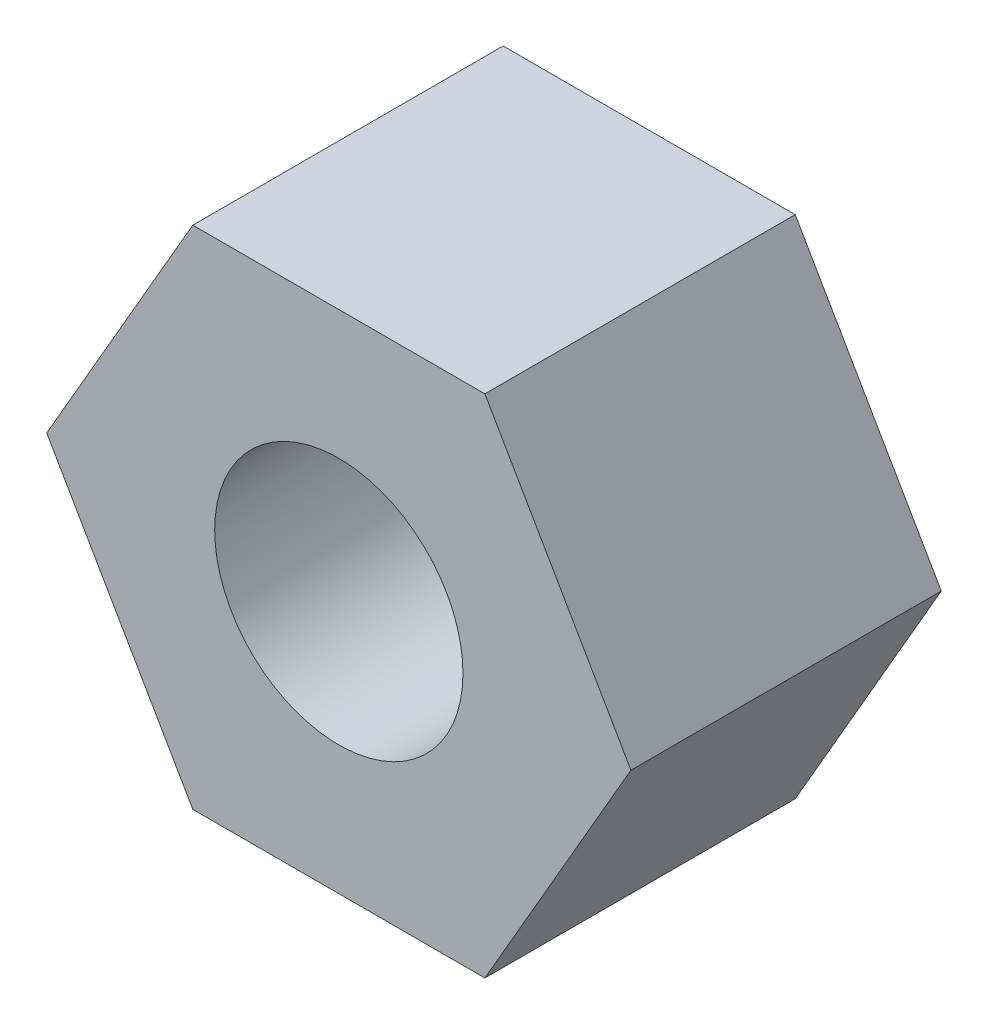
ISO-10303-21;
HEADER;
FILE_DESCRIPTION(('STEP AP214'),'2;1');
FILE_NAME('part.step','',(''),(''),'','','');
FILE_SCHEMA(('AUTOMOTIVE_DESIGN { 1 0 10303 214 1 1 1 1 }'));
ENDSEC;
DATA;
#1=APPLICATION_CONTEXT('core data for automotive mechanical design processes');
#2=APPLICATION_PROTOCOL_DEFINITION('international standard','automotive_design',2000,#1);
#3=PRODUCT_CONTEXT('',#1,'mechanical');
#4=PRODUCT('Part','Part','',(#3));
#5=PRODUCT_RELATED_PRODUCT_CATEGORY('part','',(#4));
#6=PRODUCT_DEFINITION_FORMATION('','',#4);
#7=PRODUCT_DEFINITION_CONTEXT('part definition',#1,'design');
#8=PRODUCT_DEFINITION('design','',#6,#7);
#9=PRODUCT_DEFINITION_SHAPE('','',#8);
#10=(LENGTH_UNIT() NAMED_UNIT(*) SI_UNIT(.MILLI.,.METRE.));
#11=(NAMED_UNIT(*) PLANE_ANGLE_UNIT() SI_UNIT($,.RADIAN.));
#12=(NAMED_UNIT(*) SI_UNIT($,.STERADIAN.) SOLID_ANGLE_UNIT());
#13=UNCERTAINTY_MEASURE_WITH_UNIT(LENGTH_MEASURE(1.E-05),#10,'distance_accuracy_value','');
#14=(GEOMETRIC_REPRESENTATION_CONTEXT(3) GLOBAL_UNCERTAINTY_ASSIGNED_CONTEXT((#13)) GLOBAL_UNIT_ASSIGNED_CONTEXT((#10,
#11,#12)) REPRESENTATION_CONTEXT('',''));
#15=CARTESIAN_POINT('',(0.,0.,0.));
#16=DIRECTION('',(0.,0.,1.));
#17=DIRECTION('',(1.,0.,0.));
#18=AXIS2_PLACEMENT_3D('',#15,#16,#17);
#19=CARTESIAN_POINT('',(-2.,-3.46410161513775,2.125));
#20=DIRECTION('',(0.,1.,0.));
#21=DIRECTION('',(-1.,0.,0.));
#22=AXIS2_PLACEMENT_3D('',#19,#20,#21);
#23=PLANE('',#22);
#24=DIRECTION('',(1.,0.,0.));
#25=VECTOR('',#24,1.);
#26=CARTESIAN_POINT('',(-2.,-3.46410161513775,-2.125));
#27=LINE('',#26,#25);
#28=CARTESIAN_POINT('',(-2.,-3.46410161513775,-2.125));
#29=VERTEX_POINT('',#28);
#30=CARTESIAN_POINT('',(2.,-3.46410161513775,-2.125));
#31=VERTEX_POINT('',#30);
#32=EDGE_CURVE('E128',#29,#31,#27,.T.);
#33=ORIENTED_EDGE('',*,*,#32,.T.);
#34=DIRECTION('',(0.,0.,-1.));
#35=VECTOR('',#34,1.);
#36=CARTESIAN_POINT('',(2.,-3.46410161513775,2.125));
#37=LINE('',#36,#35);
#38=CARTESIAN_POINT('',(2.,-3.46410161513775,2.125));
#39=VERTEX_POINT('',#38);
#40=EDGE_CURVE('E11',#39,#31,#37,.T.);
#41=ORIENTED_EDGE('',*,*,#40,.F.);
#42=DIRECTION('',(1.,0.,0.));
#43=VECTOR('',#42,1.);
#44=CARTESIAN_POINT('',(-2.,-3.46410161513775,2.125));
#45=LINE('',#44,#43);
#46=CARTESIAN_POINT('',(-2.,-3.46410161513775,2.125));
#47=VERTEX_POINT('',#46);
#48=EDGE_CURVE('E138',#47,#39,#45,.T.);
#49=ORIENTED_EDGE('',*,*,#48,.F.);
#50=DIRECTION('',(0.,0.,-1.));
#51=VECTOR('',#50,1.);
#52=CARTESIAN_POINT('',(-2.,-3.46410161513775,2.125));
#53=LINE('',#52,#51);
#54=EDGE_CURVE('E124',#47,#29,#53,.T.);
#55=ORIENTED_EDGE('',*,*,#54,.T.);
#56=EDGE_LOOP('',(#33,#41,#49,#55));
#57=FACE_BOUND('',#56,.T.);
#58=ADVANCED_FACE('F43',(#57),#23,.F.);
#59=CARTESIAN_POINT('',(2.,-3.46410161513775,2.125));
#60=DIRECTION('',(-0.866025403784439,0.5,0.));
#61=DIRECTION('',(-0.5,-0.866025403784439,0.));
#62=AXIS2_PLACEMENT_3D('',#59,#60,#61);
#63=PLANE('',#62);
#64=DIRECTION('',(0.5,0.866025403784439,0.));
#65=VECTOR('',#64,1.);
#66=CARTESIAN_POINT('',(2.,-3.46410161513775,-2.125));
#67=LINE('',#66,#65);
#68=CARTESIAN_POINT('',(4.,0.,-2.125));
#69=VERTEX_POINT('',#68);
#70=EDGE_CURVE('E131',#31,#69,#67,.T.);
#71=ORIENTED_EDGE('',*,*,#70,.T.);
#72=DIRECTION('',(0.,0.,-1.));
#73=VECTOR('',#72,1.);
#74=CARTESIAN_POINT('',(4.,0.,2.125));
#75=LINE('',#74,#73);
#76=CARTESIAN_POINT('',(4.,0.,2.125));
#77=VERTEX_POINT('',#76);
#78=EDGE_CURVE('E52',#77,#69,#75,.T.);
#79=ORIENTED_EDGE('',*,*,#78,.F.);
#80=DIRECTION('',(0.5,0.866025403784439,0.));
#81=VECTOR('',#80,1.);
#82=CARTESIAN_POINT('',(2.,-3.46410161513775,2.125));
#83=LINE('',#82,#81);
#84=EDGE_CURVE('E97',#39,#77,#83,.T.);
#85=ORIENTED_EDGE('',*,*,#84,.F.);
#86=ORIENTED_EDGE('',*,*,#40,.T.);
#87=EDGE_LOOP('',(#71,#79,#85,#86));
#88=FACE_BOUND('',#87,.T.);
#89=ADVANCED_FACE('F164',(#88),#63,.F.);
#90=CARTESIAN_POINT('',(4.,0.,2.125));
#91=DIRECTION('',(-0.866025403784439,-0.5,0.));
#92=DIRECTION('',(0.5,-0.866025403784439,0.));
#93=AXIS2_PLACEMENT_3D('',#90,#91,#92);
#94=PLANE('',#93);
#95=DIRECTION('',(-0.5,0.866025403784439,0.));
#96=VECTOR('',#95,1.);
#97=CARTESIAN_POINT('',(4.,0.,-2.125));
#98=LINE('',#97,#96);
#99=CARTESIAN_POINT('',(2.,3.46410161513775,-2.125));
#100=VERTEX_POINT('',#99);
#101=EDGE_CURVE('E133',#69,#100,#98,.T.);
#102=ORIENTED_EDGE('',*,*,#101,.T.);
#103=DIRECTION('',(0.,0.,-1.));
#104=VECTOR('',#103,1.);
#105=CARTESIAN_POINT('',(2.,3.46410161513775,2.125));
#106=LINE('',#105,#104);
#107=CARTESIAN_POINT('',(2.,3.46410161513775,2.125));
#108=VERTEX_POINT('',#107);
#109=EDGE_CURVE('E119',#108,#100,#106,.T.);
#110=ORIENTED_EDGE('',*,*,#109,.F.);
#111=DIRECTION('',(-0.5,0.866025403784439,0.));
#112=VECTOR('',#111,1.);
#113=CARTESIAN_POINT('',(4.,0.,2.125));
#114=LINE('',#113,#112);
#115=EDGE_CURVE('E110',#77,#108,#114,.T.);
#116=ORIENTED_EDGE('',*,*,#115,.F.);
#117=ORIENTED_EDGE('',*,*,#78,.T.);
#118=EDGE_LOOP('',(#102,#110,#116,#117));
#119=FACE_BOUND('',#118,.T.);
#120=ADVANCED_FACE('F145',(#119),#94,.F.);
#121=CARTESIAN_POINT('',(2.,3.46410161513775,2.125));
#122=DIRECTION('',(0.,-1.,0.));
#123=DIRECTION('',(1.,0.,0.));
#124=AXIS2_PLACEMENT_3D('',#121,#122,#123);
#125=PLANE('',#124);
#126=DIRECTION('',(-1.,0.,0.));
#127=VECTOR('',#126,1.);
#128=CARTESIAN_POINT('',(2.,3.46410161513775,-2.125));
#129=LINE('',#128,#127);
#130=CARTESIAN_POINT('',(-2.,3.46410161513775,-2.125));
#131=VERTEX_POINT('',#130);
#132=EDGE_CURVE('E118',#100,#131,#129,.T.);
#133=ORIENTED_EDGE('',*,*,#132,.T.);
#134=DIRECTION('',(0.,0.,-1.));
#135=VECTOR('',#134,1.);
#136=CARTESIAN_POINT('',(-2.,3.46410161513775,2.125));
#137=LINE('',#136,#135);
#138=CARTESIAN_POINT('',(-2.,3.46410161513775,2.125));
#139=VERTEX_POINT('',#138);
#140=EDGE_CURVE('E115',#139,#131,#137,.T.);
#141=ORIENTED_EDGE('',*,*,#140,.F.);
#142=DIRECTION('',(-1.,0.,0.));
#143=VECTOR('',#142,1.);
#144=CARTESIAN_POINT('',(2.,3.46410161513775,2.125));
#145=LINE('',#144,#143);
#146=EDGE_CURVE('E104',#108,#139,#145,.T.);
#147=ORIENTED_EDGE('',*,*,#146,.F.);
#148=ORIENTED_EDGE('',*,*,#109,.T.);
#149=EDGE_LOOP('',(#133,#141,#147,#148));
#150=FACE_BOUND('',#149,.T.);
#151=ADVANCED_FACE('F116',(#150),#125,.F.);
#152=CARTESIAN_POINT('',(-2.,3.46410161513775,2.125));
#153=DIRECTION('',(0.866025403784439,-0.5,0.));
#154=DIRECTION('',(0.5,0.866025403784439,0.));
#155=AXIS2_PLACEMENT_3D('',#152,#153,#154);
#156=PLANE('',#155);
#157=DIRECTION('',(-0.5,-0.866025403784439,0.));
#158=VECTOR('',#157,1.);
#159=CARTESIAN_POINT('',(-2.,3.46410161513775,-2.125));
#160=LINE('',#159,#158);
#161=CARTESIAN_POINT('',(-4.,0.,-2.125));
#162=VERTEX_POINT('',#161);
#163=EDGE_CURVE('E83',#131,#162,#160,.T.);
#164=ORIENTED_EDGE('',*,*,#163,.T.);
#165=DIRECTION('',(0.,0.,-1.));
#166=VECTOR('',#165,1.);
#167=CARTESIAN_POINT('',(-4.,0.,2.125));
#168=LINE('',#167,#166);
#169=CARTESIAN_POINT('',(-4.,0.,2.125));
#170=VERTEX_POINT('',#169);
#171=EDGE_CURVE('E120',#170,#162,#168,.T.);
#172=ORIENTED_EDGE('',*,*,#171,.F.);
#173=DIRECTION('',(-0.5,-0.866025403784439,0.));
#174=VECTOR('',#173,1.);
#175=CARTESIAN_POINT('',(-2.,3.46410161513775,2.125));
#176=LINE('',#175,#174);
#177=EDGE_CURVE('E108',#139,#170,#176,.T.);
#178=ORIENTED_EDGE('',*,*,#177,.F.);
#179=ORIENTED_EDGE('',*,*,#140,.T.);
#180=EDGE_LOOP('',(#164,#172,#178,#179));
#181=FACE_BOUND('',#180,.T.);
#182=ADVANCED_FACE('F122',(#181),#156,.F.);
#183=CARTESIAN_POINT('',(-4.,0.,2.125));
#184=DIRECTION('',(0.866025403784439,0.5,0.));
#185=DIRECTION('',(-0.5,0.866025403784439,0.));
#186=AXIS2_PLACEMENT_3D('',#183,#184,#185);
#187=PLANE('',#186);
#188=DIRECTION('',(0.5,-0.866025403784439,0.));
#189=VECTOR('',#188,1.);
#190=CARTESIAN_POINT('',(-4.,0.,-2.125));
#191=LINE('',#190,#189);
#192=EDGE_CURVE('E89',#162,#29,#191,.T.);
#193=ORIENTED_EDGE('',*,*,#192,.T.);
#194=ORIENTED_EDGE('',*,*,#54,.F.);
#195=DIRECTION('',(0.5,-0.866025403784439,0.));
#196=VECTOR('',#195,1.);
#197=CARTESIAN_POINT('',(-4.,0.,2.125));
#198=LINE('',#197,#196);
#199=EDGE_CURVE('E60',#170,#47,#198,.T.);
#200=ORIENTED_EDGE('',*,*,#199,.F.);
#201=ORIENTED_EDGE('',*,*,#171,.T.);
#202=EDGE_LOOP('',(#193,#194,#200,#201));
#203=FACE_BOUND('',#202,.T.);
#204=ADVANCED_FACE('F152',(#203),#187,.F.);
#205=CARTESIAN_POINT('',(0.,0.,2.125));
#206=DIRECTION('',(0.,0.,1.));
#207=DIRECTION('',(1.,0.,0.));
#208=AXIS2_PLACEMENT_3D('',#205,#206,#207);
#209=PLANE('',#208);
#210=CARTESIAN_POINT('',(0.,0.,2.125));
#211=DIRECTION('',(0.,0.,1.));
#212=DIRECTION('',(1.,0.,0.));
#213=AXIS2_PLACEMENT_3D('',#210,#211,#212);
#214=CIRCLE('',#213,1.69999999999999);
#215=CARTESIAN_POINT('',(1.69999999999999,0.,2.125));
#216=VERTEX_POINT('',#215);
#217=EDGE_CURVE('E46',#216,#216,#214,.T.);
#218=ORIENTED_EDGE('',*,*,#217,.F.);
#219=EDGE_LOOP('',(#218));
#220=FACE_BOUND('',#219,.T.);
#221=ORIENTED_EDGE('',*,*,#48,.T.);
#222=ORIENTED_EDGE('',*,*,#84,.T.);
#223=ORIENTED_EDGE('',*,*,#115,.T.);
#224=ORIENTED_EDGE('',*,*,#146,.T.);
#225=ORIENTED_EDGE('',*,*,#177,.T.);
#226=ORIENTED_EDGE('',*,*,#199,.T.);
#227=EDGE_LOOP('',(#221,#222,#223,#224,#225,#226));
#228=FACE_BOUND('',#227,.T.);
#229=ADVANCED_FACE('F106',(#220,#228),#209,.T.);
#230=CARTESIAN_POINT('',(0.,0.,-2.125));
#231=DIRECTION('',(0.,0.,1.));
#232=DIRECTION('',(1.,0.,0.));
#233=AXIS2_PLACEMENT_3D('',#230,#231,#232);
#234=PLANE('',#233);
#235=CARTESIAN_POINT('',(0.,0.,-2.125));
#236=DIRECTION('',(0.,0.,-1.));
#237=DIRECTION('',(-1.,0.,0.));
#238=AXIS2_PLACEMENT_3D('',#235,#236,#237);
#239=CIRCLE('',#238,3.15);
#240=CARTESIAN_POINT('',(-3.15,0.,-2.125));
#241=VERTEX_POINT('',#240);
#242=EDGE_CURVE('E231',#241,#241,#239,.T.);
#243=ORIENTED_EDGE('',*,*,#242,.F.);
#244=EDGE_LOOP('',(#243));
#245=FACE_BOUND('',#244,.T.);
#246=ORIENTED_EDGE('',*,*,#32,.F.);
#247=ORIENTED_EDGE('',*,*,#192,.F.);
#248=ORIENTED_EDGE('',*,*,#163,.F.);
#249=ORIENTED_EDGE('',*,*,#132,.F.);
#250=ORIENTED_EDGE('',*,*,#101,.F.);
#251=ORIENTED_EDGE('',*,*,#70,.F.);
#252=EDGE_LOOP('',(#246,#247,#248,#249,#250,#251));
#253=FACE_BOUND('',#252,.T.);
#254=ADVANCED_FACE('F148',(#245,#253),#234,.F.);
#255=CARTESIAN_POINT('',(0.,0.,-2.125));
#256=DIRECTION('',(0.,0.,-1.));
#257=DIRECTION('',(-1.,0.,0.));
#258=AXIS2_PLACEMENT_3D('',#255,#256,#257);
#259=CYLINDRICAL_SURFACE('',#258,1.69999999999999);
#260=ORIENTED_EDGE('',*,*,#217,.T.);
#261=EDGE_LOOP('',(#260));
#262=FACE_BOUND('',#261,.T.);
#263=CARTESIAN_POINT('',(0.,0.,-0.674999999999993));
#264=DIRECTION('',(0.,0.,-1.));
#265=DIRECTION('',(-1.,0.,0.));
#266=AXIS2_PLACEMENT_3D('',#263,#264,#265);
#267=CIRCLE('',#266,1.69999999999999);
#268=CARTESIAN_POINT('',(-1.69999999999999,0.,-0.674999999999993));
#269=VERTEX_POINT('',#268);
#270=EDGE_CURVE('E228',#269,#269,#267,.T.);
#271=ORIENTED_EDGE('',*,*,#270,.T.);
#272=EDGE_LOOP('',(#271));
#273=FACE_BOUND('',#272,.T.);
#274=ADVANCED_FACE('F203',(#262,#273),#259,.F.);
#275=CARTESIAN_POINT('',(0.,0.,-2.125));
#276=DIRECTION('',(0.,0.,-1.));
#277=DIRECTION('',(-1.,0.,0.));
#278=AXIS2_PLACEMENT_3D('',#275,#276,#277);
#279=CONICAL_SURFACE('',#278,3.15,0.78539816339745);
#280=ORIENTED_EDGE('',*,*,#270,.F.);
#281=EDGE_LOOP('',(#280));
#282=FACE_BOUND('',#281,.T.);
#283=ORIENTED_EDGE('',*,*,#242,.T.);
#284=EDGE_LOOP('',(#283));
#285=FACE_BOUND('',#284,.T.);
#286=ADVANCED_FACE('F212',(#282,#285),#279,.F.);
#287=CLOSED_SHELL('',(#58,#89,#120,#151,#182,#204,#229,#254,#274,#286));
#288=MANIFOLD_SOLID_BREP('B2',#287);
#289=ADVANCED_BREP_SHAPE_REPRESENTATION('',(#18,#288),#14);
#290=SHAPE_DEFINITION_REPRESENTATION(#9,#289);
ENDSEC;
END-ISO-10303-21;
